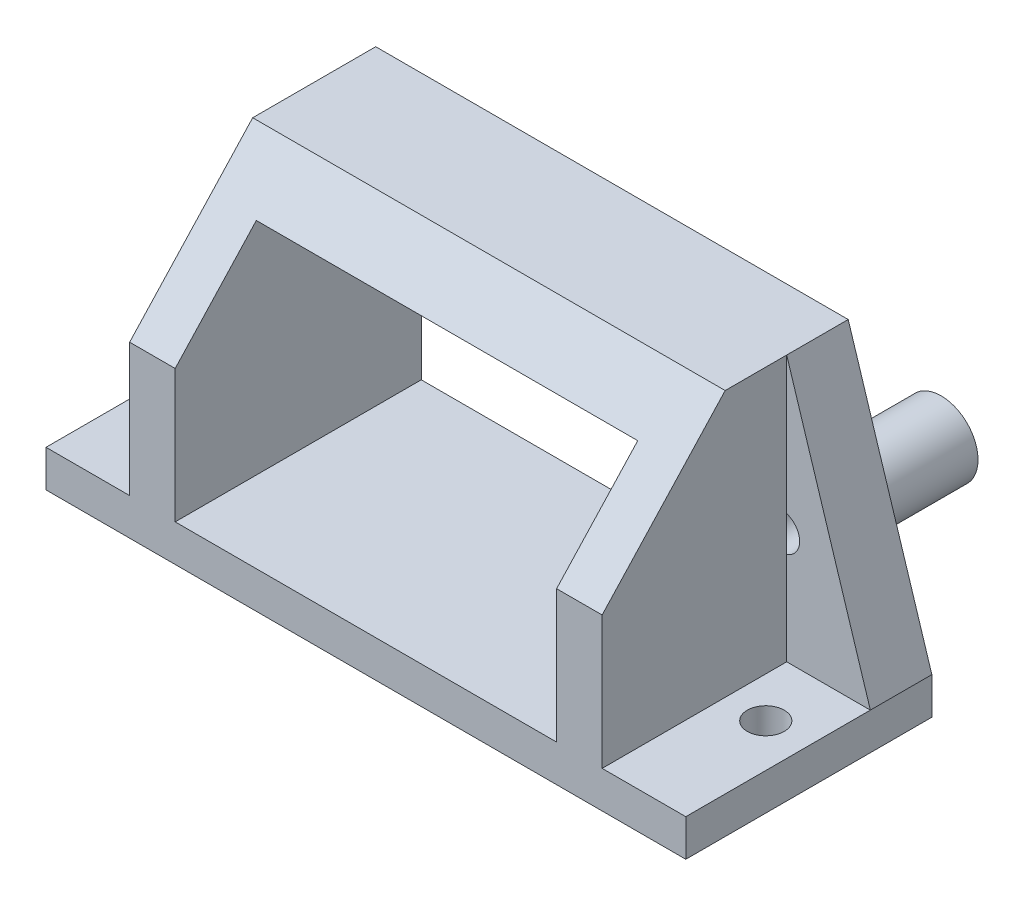
ISO-10303-21;
HEADER;
FILE_DESCRIPTION(('STEP AP214'),'2;1');
FILE_NAME('part.step','',(''),(''),'','','');
FILE_SCHEMA(('AUTOMOTIVE_DESIGN { 1 0 10303 214 1 1 1 1 }'));
ENDSEC;
DATA;
#1=APPLICATION_CONTEXT('core data for automotive mechanical design processes');
#2=APPLICATION_PROTOCOL_DEFINITION('international standard','automotive_design',2000,#1);
#3=PRODUCT_CONTEXT('',#1,'mechanical');
#4=PRODUCT('Part','Part','',(#3));
#5=PRODUCT_RELATED_PRODUCT_CATEGORY('part','',(#4));
#6=PRODUCT_DEFINITION_FORMATION('','',#4);
#7=PRODUCT_DEFINITION_CONTEXT('part definition',#1,'design');
#8=PRODUCT_DEFINITION('design','',#6,#7);
#9=PRODUCT_DEFINITION_SHAPE('','',#8);
#10=(LENGTH_UNIT() NAMED_UNIT(*) SI_UNIT(.MILLI.,.METRE.));
#11=(NAMED_UNIT(*) PLANE_ANGLE_UNIT() SI_UNIT($,.RADIAN.));
#12=(NAMED_UNIT(*) SI_UNIT($,.STERADIAN.) SOLID_ANGLE_UNIT());
#13=UNCERTAINTY_MEASURE_WITH_UNIT(LENGTH_MEASURE(1.E-05),#10,'distance_accuracy_value','');
#14=(GEOMETRIC_REPRESENTATION_CONTEXT(3) GLOBAL_UNCERTAINTY_ASSIGNED_CONTEXT((#13)) GLOBAL_UNIT_ASSIGNED_CONTEXT((#10,
#11,#12)) REPRESENTATION_CONTEXT('',''));
#15=CARTESIAN_POINT('',(0.,0.,0.));
#16=DIRECTION('',(0.,0.,1.));
#17=DIRECTION('',(1.,0.,0.));
#18=AXIS2_PLACEMENT_3D('',#15,#16,#17);
#19=CARTESIAN_POINT('',(0.,0.,0.));
#20=DIRECTION('',(0.,0.,1.));
#21=DIRECTION('',(1.,0.,0.));
#22=AXIS2_PLACEMENT_3D('',#19,#20,#21);
#23=PLANE('',#22);
#24=CARTESIAN_POINT('',(-18.75,12.,0.));
#25=DIRECTION('',(0.,0.,1.));
#26=DIRECTION('',(1.,0.,0.));
#27=AXIS2_PLACEMENT_3D('',#24,#25,#26);
#28=CIRCLE('',#27,3.);
#29=CARTESIAN_POINT('',(-15.75,12.,0.));
#30=VERTEX_POINT('',#29);
#31=EDGE_CURVE('E41',#30,#30,#28,.F.);
#32=ORIENTED_EDGE('',*,*,#31,.F.);
#33=EDGE_LOOP('',(#32));
#34=FACE_BOUND('',#33,.T.);
#35=DIRECTION('',(-0.30028587523271,0.953849250739196,0.));
#36=VECTOR('',#35,1.);
#37=CARTESIAN_POINT('',(19.2012575883234,24.5960053076786,0.));
#38=LINE('',#37,#36);
#39=CARTESIAN_POINT('',(26.,3.,0.));
#40=VERTEX_POINT('',#39);
#41=CARTESIAN_POINT('',(19.2012575883234,24.5960053076786,0.));
#42=VERTEX_POINT('',#41);
#43=EDGE_CURVE('E409',#40,#42,#38,.T.);
#44=ORIENTED_EDGE('',*,*,#43,.F.);
#45=DIRECTION('',(0.,1.,0.));
#46=VECTOR('',#45,1.);
#47=CARTESIAN_POINT('',(26.,0.,0.));
#48=LINE('',#47,#46);
#49=CARTESIAN_POINT('',(26.,0.,0.));
#50=VERTEX_POINT('',#49);
#51=EDGE_CURVE('E413',#50,#40,#48,.T.);
#52=ORIENTED_EDGE('',*,*,#51,.F.);
#53=DIRECTION('',(1.,0.,0.));
#54=VECTOR('',#53,1.);
#55=CARTESIAN_POINT('',(-26.,0.,0.));
#56=LINE('',#55,#54);
#57=CARTESIAN_POINT('',(-26.,0.,0.));
#58=VERTEX_POINT('',#57);
#59=EDGE_CURVE('E428',#58,#50,#56,.T.);
#60=ORIENTED_EDGE('',*,*,#59,.F.);
#61=DIRECTION('',(0.,-1.,0.));
#62=VECTOR('',#61,1.);
#63=CARTESIAN_POINT('',(-26.,3.,0.));
#64=LINE('',#63,#62);
#65=CARTESIAN_POINT('',(-26.,3.,0.));
#66=VERTEX_POINT('',#65);
#67=EDGE_CURVE('E426',#66,#58,#64,.T.);
#68=ORIENTED_EDGE('',*,*,#67,.F.);
#69=DIRECTION('',(-0.30028587523271,-0.953849250739196,0.));
#70=VECTOR('',#69,1.);
#71=CARTESIAN_POINT('',(-26.,3.,0.));
#72=LINE('',#71,#70);
#73=CARTESIAN_POINT('',(-19.2012575883234,24.5960053076786,0.));
#74=VERTEX_POINT('',#73);
#75=EDGE_CURVE('E423',#74,#66,#72,.T.);
#76=ORIENTED_EDGE('',*,*,#75,.F.);
#77=DIRECTION('',(-1.,0.,0.));
#78=VECTOR('',#77,1.);
#79=CARTESIAN_POINT('',(19.2012575883234,24.5960053076786,0.));
#80=LINE('',#79,#78);
#81=EDGE_CURVE('E421',#42,#74,#80,.T.);
#82=ORIENTED_EDGE('',*,*,#81,.F.);
#83=EDGE_LOOP('',(#44,#52,#60,#68,#76,#82));
#84=FACE_BOUND('',#83,.T.);
#85=DIRECTION('',(1.,0.,0.));
#86=VECTOR('',#85,1.);
#87=CARTESIAN_POINT('',(-15.5,3.,0.));
#88=LINE('',#87,#86);
#89=CARTESIAN_POINT('',(-15.5,3.,0.));
#90=VERTEX_POINT('',#89);
#91=CARTESIAN_POINT('',(15.5,3.,0.));
#92=VERTEX_POINT('',#91);
#93=EDGE_CURVE('E374',#90,#92,#88,.T.);
#94=ORIENTED_EDGE('',*,*,#93,.T.);
#95=DIRECTION('',(0.,1.,0.));
#96=VECTOR('',#95,1.);
#97=CARTESIAN_POINT('',(15.5,20.9192804275844,0.));
#98=LINE('',#97,#96);
#99=CARTESIAN_POINT('',(15.5,20.9192804275844,0.));
#100=VERTEX_POINT('',#99);
#101=EDGE_CURVE('E383',#92,#100,#98,.T.);
#102=ORIENTED_EDGE('',*,*,#101,.T.);
#103=DIRECTION('',(-1.,0.,0.));
#104=VECTOR('',#103,1.);
#105=CARTESIAN_POINT('',(-15.5,20.9192804275844,0.));
#106=LINE('',#105,#104);
#107=CARTESIAN_POINT('',(-15.5,20.9192804275844,0.));
#108=VERTEX_POINT('',#107);
#109=EDGE_CURVE('E397',#100,#108,#106,.T.);
#110=ORIENTED_EDGE('',*,*,#109,.T.);
#111=DIRECTION('',(0.,-1.,0.));
#112=VECTOR('',#111,1.);
#113=CARTESIAN_POINT('',(-15.5,3.,0.));
#114=LINE('',#113,#112);
#115=EDGE_CURVE('E389',#108,#90,#114,.T.);
#116=ORIENTED_EDGE('',*,*,#115,.T.);
#117=EDGE_LOOP('',(#94,#102,#110,#116));
#118=FACE_BOUND('',#117,.T.);
#119=CARTESIAN_POINT('',(18.75,12.,0.));
#120=DIRECTION('',(0.,0.,1.));
#121=DIRECTION('',(1.,0.,0.));
#122=AXIS2_PLACEMENT_3D('',#119,#120,#121);
#123=CIRCLE('',#122,3.);
#124=CARTESIAN_POINT('',(21.75,12.,0.));
#125=VERTEX_POINT('',#124);
#126=EDGE_CURVE('E11',#125,#125,#123,.F.);
#127=ORIENTED_EDGE('',*,*,#126,.F.);
#128=EDGE_LOOP('',(#127));
#129=FACE_BOUND('',#128,.T.);
#130=ADVANCED_FACE('F33',(#34,#84,#118,#129),#23,.F.);
#131=CARTESIAN_POINT('',(0.,0.,20.));
#132=DIRECTION('',(0.,0.,1.));
#133=DIRECTION('',(1.,0.,0.));
#134=AXIS2_PLACEMENT_3D('',#131,#132,#133);
#135=PLANE('',#134);
#136=DIRECTION('',(0.,1.,0.));
#137=VECTOR('',#136,1.);
#138=CARTESIAN_POINT('',(-19.2012575883234,3.,20.));
#139=LINE('',#138,#137);
#140=CARTESIAN_POINT('',(-19.2012575883234,3.,20.));
#141=VERTEX_POINT('',#140);
#142=CARTESIAN_POINT('',(-19.2012575883234,13.7980026538393,20.));
#143=VERTEX_POINT('',#142);
#144=EDGE_CURVE('E197',#141,#143,#139,.T.);
#145=ORIENTED_EDGE('',*,*,#144,.F.);
#146=DIRECTION('',(1.,0.,0.));
#147=VECTOR('',#146,1.);
#148=CARTESIAN_POINT('',(-26.,3.,20.));
#149=LINE('',#148,#147);
#150=CARTESIAN_POINT('',(-26.,3.,20.));
#151=VERTEX_POINT('',#150);
#152=EDGE_CURVE('E193',#151,#141,#149,.T.);
#153=ORIENTED_EDGE('',*,*,#152,.F.);
#154=DIRECTION('',(0.,-1.,0.));
#155=VECTOR('',#154,1.);
#156=CARTESIAN_POINT('',(-26.,3.,20.));
#157=LINE('',#156,#155);
#158=CARTESIAN_POINT('',(-26.,0.,20.));
#159=VERTEX_POINT('',#158);
#160=EDGE_CURVE('E410',#151,#159,#157,.T.);
#161=ORIENTED_EDGE('',*,*,#160,.T.);
#162=DIRECTION('',(1.,0.,0.));
#163=VECTOR('',#162,1.);
#164=CARTESIAN_POINT('',(-26.,0.,20.));
#165=LINE('',#164,#163);
#166=CARTESIAN_POINT('',(26.,0.,20.));
#167=VERTEX_POINT('',#166);
#168=EDGE_CURVE('E412',#159,#167,#165,.T.);
#169=ORIENTED_EDGE('',*,*,#168,.T.);
#170=DIRECTION('',(0.,1.,0.));
#171=VECTOR('',#170,1.);
#172=CARTESIAN_POINT('',(26.,0.,20.));
#173=LINE('',#172,#171);
#174=CARTESIAN_POINT('',(26.,3.,20.));
#175=VERTEX_POINT('',#174);
#176=EDGE_CURVE('E415',#167,#175,#173,.T.);
#177=ORIENTED_EDGE('',*,*,#176,.T.);
#178=DIRECTION('',(1.,0.,0.));
#179=VECTOR('',#178,1.);
#180=CARTESIAN_POINT('',(19.2012575883234,3.,20.));
#181=LINE('',#180,#179);
#182=CARTESIAN_POINT('',(19.2012575883234,3.,20.));
#183=VERTEX_POINT('',#182);
#184=EDGE_CURVE('E186',#183,#175,#181,.T.);
#185=ORIENTED_EDGE('',*,*,#184,.F.);
#186=DIRECTION('',(0.,-1.,0.));
#187=VECTOR('',#186,1.);
#188=CARTESIAN_POINT('',(19.2012575883234,24.5960053076786,20.));
#189=LINE('',#188,#187);
#190=CARTESIAN_POINT('',(19.2012575883234,13.7980026538393,20.));
#191=VERTEX_POINT('',#190);
#192=EDGE_CURVE('E187',#191,#183,#189,.T.);
#193=ORIENTED_EDGE('',*,*,#192,.F.);
#194=DIRECTION('',(1.,0.,0.));
#195=VECTOR('',#194,1.);
#196=CARTESIAN_POINT('',(-61.5,13.7980026538393,20.));
#197=LINE('',#196,#195);
#198=CARTESIAN_POINT('',(15.5,13.7980026538393,20.));
#199=VERTEX_POINT('',#198);
#200=EDGE_CURVE('E457',#199,#191,#197,.T.);
#201=ORIENTED_EDGE('',*,*,#200,.F.);
#202=DIRECTION('',(0.,1.,0.));
#203=VECTOR('',#202,1.);
#204=CARTESIAN_POINT('',(15.5,20.9192804275844,20.));
#205=LINE('',#204,#203);
#206=CARTESIAN_POINT('',(15.5,3.,20.));
#207=VERTEX_POINT('',#206);
#208=EDGE_CURVE('E400',#207,#199,#205,.T.);
#209=ORIENTED_EDGE('',*,*,#208,.F.);
#210=DIRECTION('',(1.,0.,0.));
#211=VECTOR('',#210,1.);
#212=CARTESIAN_POINT('',(-15.5,3.,20.));
#213=LINE('',#212,#211);
#214=CARTESIAN_POINT('',(-15.5,3.,20.));
#215=VERTEX_POINT('',#214);
#216=EDGE_CURVE('E398',#215,#207,#213,.T.);
#217=ORIENTED_EDGE('',*,*,#216,.F.);
#218=DIRECTION('',(0.,-1.,0.));
#219=VECTOR('',#218,1.);
#220=CARTESIAN_POINT('',(-15.5,3.,20.));
#221=LINE('',#220,#219);
#222=CARTESIAN_POINT('',(-15.5,13.7980026538393,20.));
#223=VERTEX_POINT('',#222);
#224=EDGE_CURVE('E392',#223,#215,#221,.T.);
#225=ORIENTED_EDGE('',*,*,#224,.F.);
#226=EDGE_CURVE('E451',#143,#223,#197,.T.);
#227=ORIENTED_EDGE('',*,*,#226,.F.);
#228=EDGE_LOOP('',(#145,#153,#161,#169,#177,#185,#193,#201,#209,#217,#225,#227));
#229=FACE_BOUND('',#228,.T.);
#230=ADVANCED_FACE('F245',(#229),#135,.T.);
#231=CARTESIAN_POINT('',(19.2012575883234,24.5960053076786,20.));
#232=DIRECTION('',(-0.953849250739196,-0.30028587523271,0.));
#233=DIRECTION('',(0.30028587523271,-0.953849250739196,0.));
#234=AXIS2_PLACEMENT_3D('',#231,#232,#233);
#235=PLANE('',#234);
#236=DIRECTION('',(0.,0.,-1.));
#237=VECTOR('',#236,1.);
#238=CARTESIAN_POINT('',(19.2012575883234,24.5960053076786,20.));
#239=LINE('',#238,#237);
#240=CARTESIAN_POINT('',(19.2012575883234,24.5960053076786,4.99999999999995));
#241=VERTEX_POINT('',#240);
#242=EDGE_CURVE('E293',#241,#42,#239,.T.);
#243=ORIENTED_EDGE('',*,*,#242,.F.);
#244=DIRECTION('',(-0.30028587523271,0.953849250739196,0.));
#245=VECTOR('',#244,1.);
#246=CARTESIAN_POINT('',(26.,3.,4.99999999999995));
#247=LINE('',#246,#245);
#248=CARTESIAN_POINT('',(26.,3.,4.99999999999995));
#249=VERTEX_POINT('',#248);
#250=EDGE_CURVE('E180',#249,#241,#247,.T.);
#251=ORIENTED_EDGE('',*,*,#250,.F.);
#252=DIRECTION('',(0.,0.,-1.));
#253=VECTOR('',#252,1.);
#254=CARTESIAN_POINT('',(26.,3.,20.));
#255=LINE('',#254,#253);
#256=EDGE_CURVE('E418',#249,#40,#255,.T.);
#257=ORIENTED_EDGE('',*,*,#256,.T.);
#258=ORIENTED_EDGE('',*,*,#43,.T.);
#259=EDGE_LOOP('',(#243,#251,#257,#258));
#260=FACE_BOUND('',#259,.T.);
#261=ADVANCED_FACE('F35',(#260),#235,.F.);
#262=CARTESIAN_POINT('',(19.2012575883234,24.5960053076786,20.));
#263=DIRECTION('',(0.,-1.,0.));
#264=DIRECTION('',(1.,0.,0.));
#265=AXIS2_PLACEMENT_3D('',#262,#263,#264);
#266=PLANE('',#265);
#267=DIRECTION('',(0.,0.,-1.));
#268=VECTOR('',#267,1.);
#269=CARTESIAN_POINT('',(-19.2012575883234,24.5960053076786,20.));
#270=LINE('',#269,#268);
#271=CARTESIAN_POINT('',(-19.2012575883234,24.5960053076786,10.));
#272=VERTEX_POINT('',#271);
#273=CARTESIAN_POINT('',(-19.2012575883234,24.5960053076786,4.99999999999995));
#274=VERTEX_POINT('',#273);
#275=EDGE_CURVE('E284',#272,#274,#270,.T.);
#276=ORIENTED_EDGE('',*,*,#275,.F.);
#277=DIRECTION('',(1.,0.,0.));
#278=VECTOR('',#277,1.);
#279=CARTESIAN_POINT('',(-61.5,24.5960053076786,10.));
#280=LINE('',#279,#278);
#281=CARTESIAN_POINT('',(19.2012575883234,24.5960053076786,10.));
#282=VERTEX_POINT('',#281);
#283=EDGE_CURVE('E287',#272,#282,#280,.T.);
#284=ORIENTED_EDGE('',*,*,#283,.T.);
#285=EDGE_CURVE('E295',#282,#241,#239,.T.);
#286=ORIENTED_EDGE('',*,*,#285,.T.);
#287=ORIENTED_EDGE('',*,*,#242,.T.);
#288=ORIENTED_EDGE('',*,*,#81,.T.);
#289=EDGE_CURVE('E289',#274,#74,#270,.T.);
#290=ORIENTED_EDGE('',*,*,#289,.F.);
#291=EDGE_LOOP('',(#276,#284,#286,#287,#288,#290));
#292=FACE_BOUND('',#291,.T.);
#293=ADVANCED_FACE('F272',(#292),#266,.F.);
#294=CARTESIAN_POINT('',(-26.,3.,20.));
#295=DIRECTION('',(0.953849250739196,-0.30028587523271,0.));
#296=DIRECTION('',(0.30028587523271,0.953849250739196,0.));
#297=AXIS2_PLACEMENT_3D('',#294,#295,#296);
#298=PLANE('',#297);
#299=DIRECTION('',(0.,0.,-1.));
#300=VECTOR('',#299,1.);
#301=CARTESIAN_POINT('',(-26.,3.,20.));
#302=LINE('',#301,#300);
#303=CARTESIAN_POINT('',(-26.,3.,4.99999999999995));
#304=VERTEX_POINT('',#303);
#305=EDGE_CURVE('E438',#304,#66,#302,.T.);
#306=ORIENTED_EDGE('',*,*,#305,.F.);
#307=DIRECTION('',(-0.300285875232709,-0.953849250739196,0.));
#308=VECTOR('',#307,1.);
#309=CARTESIAN_POINT('',(-19.2012575883234,24.5960053076786,4.99999999999995));
#310=LINE('',#309,#308);
#311=EDGE_CURVE('E202',#274,#304,#310,.T.);
#312=ORIENTED_EDGE('',*,*,#311,.F.);
#313=ORIENTED_EDGE('',*,*,#289,.T.);
#314=ORIENTED_EDGE('',*,*,#75,.T.);
#315=EDGE_LOOP('',(#306,#312,#313,#314));
#316=FACE_BOUND('',#315,.T.);
#317=ADVANCED_FACE('F269',(#316),#298,.F.);
#318=CARTESIAN_POINT('',(-26.,3.,20.));
#319=DIRECTION('',(1.,0.,0.));
#320=DIRECTION('',(0.,1.,0.));
#321=AXIS2_PLACEMENT_3D('',#318,#319,#320);
#322=PLANE('',#321);
#323=ORIENTED_EDGE('',*,*,#67,.T.);
#324=DIRECTION('',(0.,0.,-1.));
#325=VECTOR('',#324,1.);
#326=CARTESIAN_POINT('',(-26.,0.,20.));
#327=LINE('',#326,#325);
#328=EDGE_CURVE('E436',#159,#58,#327,.T.);
#329=ORIENTED_EDGE('',*,*,#328,.F.);
#330=ORIENTED_EDGE('',*,*,#160,.F.);
#331=EDGE_CURVE('E297',#151,#304,#302,.T.);
#332=ORIENTED_EDGE('',*,*,#331,.T.);
#333=ORIENTED_EDGE('',*,*,#305,.T.);
#334=EDGE_LOOP('',(#323,#329,#330,#332,#333));
#335=FACE_BOUND('',#334,.T.);
#336=ADVANCED_FACE('F265',(#335),#322,.F.);
#337=CARTESIAN_POINT('',(-26.,0.,20.));
#338=DIRECTION('',(0.,1.,0.));
#339=DIRECTION('',(0.,0.,1.));
#340=AXIS2_PLACEMENT_3D('',#337,#338,#339);
#341=PLANE('',#340);
#342=CARTESIAN_POINT('',(22.5,0.,10.));
#343=DIRECTION('',(0.,-1.,0.));
#344=DIRECTION('',(0.,0.,-1.));
#345=AXIS2_PLACEMENT_3D('',#342,#343,#344);
#346=CIRCLE('',#345,1.5);
#347=CARTESIAN_POINT('',(22.5,0.,8.5));
#348=VERTEX_POINT('',#347);
#349=EDGE_CURVE('E212',#348,#348,#346,.T.);
#350=ORIENTED_EDGE('',*,*,#349,.F.);
#351=EDGE_LOOP('',(#350));
#352=FACE_BOUND('',#351,.T.);
#353=CARTESIAN_POINT('',(-22.5,0.,10.));
#354=DIRECTION('',(0.,-1.,0.));
#355=DIRECTION('',(0.,0.,-1.));
#356=AXIS2_PLACEMENT_3D('',#353,#354,#355);
#357=CIRCLE('',#356,1.5);
#358=CARTESIAN_POINT('',(-22.5,0.,8.5));
#359=VERTEX_POINT('',#358);
#360=EDGE_CURVE('E208',#359,#359,#357,.T.);
#361=ORIENTED_EDGE('',*,*,#360,.F.);
#362=EDGE_LOOP('',(#361));
#363=FACE_BOUND('',#362,.T.);
#364=ORIENTED_EDGE('',*,*,#59,.T.);
#365=DIRECTION('',(0.,0.,-1.));
#366=VECTOR('',#365,1.);
#367=CARTESIAN_POINT('',(26.,0.,20.));
#368=LINE('',#367,#366);
#369=EDGE_CURVE('E434',#167,#50,#368,.T.);
#370=ORIENTED_EDGE('',*,*,#369,.F.);
#371=ORIENTED_EDGE('',*,*,#168,.F.);
#372=ORIENTED_EDGE('',*,*,#328,.T.);
#373=EDGE_LOOP('',(#364,#370,#371,#372));
#374=FACE_BOUND('',#373,.T.);
#375=ADVANCED_FACE('F261',(#352,#363,#374),#341,.F.);
#376=CARTESIAN_POINT('',(26.,0.,20.));
#377=DIRECTION('',(-1.,0.,0.));
#378=DIRECTION('',(0.,0.,1.));
#379=AXIS2_PLACEMENT_3D('',#376,#377,#378);
#380=PLANE('',#379);
#381=ORIENTED_EDGE('',*,*,#51,.T.);
#382=ORIENTED_EDGE('',*,*,#256,.F.);
#383=EDGE_CURVE('E432',#175,#249,#255,.T.);
#384=ORIENTED_EDGE('',*,*,#383,.F.);
#385=ORIENTED_EDGE('',*,*,#176,.F.);
#386=ORIENTED_EDGE('',*,*,#369,.T.);
#387=EDGE_LOOP('',(#381,#382,#384,#385,#386));
#388=FACE_BOUND('',#387,.T.);
#389=ADVANCED_FACE('F257',(#388),#380,.F.);
#390=CARTESIAN_POINT('',(-15.5,3.,20.));
#391=DIRECTION('',(0.,1.,0.));
#392=DIRECTION('',(-1.,0.,0.));
#393=AXIS2_PLACEMENT_3D('',#390,#391,#392);
#394=PLANE('',#393);
#395=ORIENTED_EDGE('',*,*,#93,.F.);
#396=DIRECTION('',(0.,0.,-1.));
#397=VECTOR('',#396,1.);
#398=CARTESIAN_POINT('',(-15.5,3.,20.));
#399=LINE('',#398,#397);
#400=EDGE_CURVE('E376',#215,#90,#399,.T.);
#401=ORIENTED_EDGE('',*,*,#400,.F.);
#402=ORIENTED_EDGE('',*,*,#216,.T.);
#403=DIRECTION('',(0.,0.,-1.));
#404=VECTOR('',#403,1.);
#405=CARTESIAN_POINT('',(15.5,3.,20.));
#406=LINE('',#405,#404);
#407=EDGE_CURVE('E379',#207,#92,#406,.T.);
#408=ORIENTED_EDGE('',*,*,#407,.T.);
#409=EDGE_LOOP('',(#395,#401,#402,#408));
#410=FACE_BOUND('',#409,.T.);
#411=ADVANCED_FACE('F260',(#410),#394,.T.);
#412=CARTESIAN_POINT('',(15.5,20.9192804275844,20.));
#413=DIRECTION('',(-1.,0.,0.));
#414=DIRECTION('',(0.,0.,1.));
#415=AXIS2_PLACEMENT_3D('',#412,#413,#414);
#416=PLANE('',#415);
#417=DIRECTION('',(0.,-0.73369802558179,0.679475685552753));
#418=VECTOR('',#417,1.);
#419=CARTESIAN_POINT('',(15.5,17.6314775801199,16.4498296127778));
#420=LINE('',#419,#418);
#421=CARTESIAN_POINT('',(15.5,20.9192804275844,13.4050046086874));
#422=VERTEX_POINT('',#421);
#423=EDGE_CURVE('E384',#422,#199,#420,.T.);
#424=ORIENTED_EDGE('',*,*,#423,.F.);
#425=DIRECTION('',(0.,0.,-1.));
#426=VECTOR('',#425,1.);
#427=CARTESIAN_POINT('',(15.5,20.9192804275844,20.));
#428=LINE('',#427,#426);
#429=EDGE_CURVE('E406',#422,#100,#428,.T.);
#430=ORIENTED_EDGE('',*,*,#429,.T.);
#431=ORIENTED_EDGE('',*,*,#101,.F.);
#432=ORIENTED_EDGE('',*,*,#407,.F.);
#433=ORIENTED_EDGE('',*,*,#208,.T.);
#434=EDGE_LOOP('',(#424,#430,#431,#432,#433));
#435=FACE_BOUND('',#434,.T.);
#436=ADVANCED_FACE('F363',(#435),#416,.T.);
#437=CARTESIAN_POINT('',(-15.5,20.9192804275844,20.));
#438=DIRECTION('',(0.,-1.,0.));
#439=DIRECTION('',(0.,0.,-1.));
#440=AXIS2_PLACEMENT_3D('',#437,#438,#439);
#441=PLANE('',#440);
#442=DIRECTION('',(1.,0.,0.));
#443=VECTOR('',#442,1.);
#444=CARTESIAN_POINT('',(-15.5,20.9192804275844,13.4050046086874));
#445=LINE('',#444,#443);
#446=CARTESIAN_POINT('',(-15.5,20.9192804275844,13.4050046086874));
#447=VERTEX_POINT('',#446);
#448=EDGE_CURVE('E454',#447,#422,#445,.T.);
#449=ORIENTED_EDGE('',*,*,#448,.F.);
#450=DIRECTION('',(0.,0.,-1.));
#451=VECTOR('',#450,1.);
#452=CARTESIAN_POINT('',(-15.5,20.9192804275844,20.));
#453=LINE('',#452,#451);
#454=EDGE_CURVE('E393',#447,#108,#453,.T.);
#455=ORIENTED_EDGE('',*,*,#454,.T.);
#456=ORIENTED_EDGE('',*,*,#109,.F.);
#457=ORIENTED_EDGE('',*,*,#429,.F.);
#458=EDGE_LOOP('',(#449,#455,#456,#457));
#459=FACE_BOUND('',#458,.T.);
#460=ADVANCED_FACE('F359',(#459),#441,.T.);
#461=CARTESIAN_POINT('',(-15.5,3.,20.));
#462=DIRECTION('',(1.,0.,0.));
#463=DIRECTION('',(0.,0.,-1.));
#464=AXIS2_PLACEMENT_3D('',#461,#462,#463);
#465=PLANE('',#464);
#466=DIRECTION('',(0.,0.73369802558179,-0.679475685552753));
#467=VECTOR('',#466,1.);
#468=CARTESIAN_POINT('',(-15.5,7.98529968920888,25.3831279274262));
#469=LINE('',#468,#467);
#470=EDGE_CURVE('E301',#223,#447,#469,.T.);
#471=ORIENTED_EDGE('',*,*,#470,.F.);
#472=ORIENTED_EDGE('',*,*,#224,.T.);
#473=ORIENTED_EDGE('',*,*,#400,.T.);
#474=ORIENTED_EDGE('',*,*,#115,.F.);
#475=ORIENTED_EDGE('',*,*,#454,.F.);
#476=EDGE_LOOP('',(#471,#472,#473,#474,#475));
#477=FACE_BOUND('',#476,.T.);
#478=ADVANCED_FACE('F355',(#477),#465,.T.);
#479=CARTESIAN_POINT('',(-61.5,13.7980026538393,20.));
#480=DIRECTION('',(0.,-0.679475685552753,-0.73369802558179));
#481=DIRECTION('',(0.,0.73369802558179,-0.679475685552753));
#482=AXIS2_PLACEMENT_3D('',#479,#480,#481);
#483=PLANE('',#482);
#484=ORIENTED_EDGE('',*,*,#283,.F.);
#485=DIRECTION('',(0.,-0.73369802558179,0.679475685552753));
#486=VECTOR('',#485,1.);
#487=CARTESIAN_POINT('',(-19.2012575883234,13.7980026538393,20.));
#488=LINE('',#487,#486);
#489=EDGE_CURVE('E162',#272,#143,#488,.T.);
#490=ORIENTED_EDGE('',*,*,#489,.T.);
#491=ORIENTED_EDGE('',*,*,#226,.T.);
#492=ORIENTED_EDGE('',*,*,#470,.T.);
#493=ORIENTED_EDGE('',*,*,#448,.T.);
#494=ORIENTED_EDGE('',*,*,#423,.T.);
#495=ORIENTED_EDGE('',*,*,#200,.T.);
#496=DIRECTION('',(0.,0.73369802558179,-0.679475685552753));
#497=VECTOR('',#496,1.);
#498=CARTESIAN_POINT('',(19.2012575883234,13.7980026538393,20.));
#499=LINE('',#498,#497);
#500=EDGE_CURVE('E303',#191,#282,#499,.T.);
#501=ORIENTED_EDGE('',*,*,#500,.T.);
#502=EDGE_LOOP('',(#484,#490,#491,#492,#493,#494,#495,#501));
#503=FACE_BOUND('',#502,.T.);
#504=ADVANCED_FACE('F352',(#503),#483,.F.);
#505=CARTESIAN_POINT('',(19.2012575883234,24.5960053076786,4.99999999999995));
#506=DIRECTION('',(-1.,0.,0.));
#507=DIRECTION('',(0.,-1.,0.));
#508=AXIS2_PLACEMENT_3D('',#505,#506,#507);
#509=PLANE('',#508);
#510=ORIENTED_EDGE('',*,*,#192,.T.);
#511=DIRECTION('',(0.,0.,1.));
#512=VECTOR('',#511,1.);
#513=CARTESIAN_POINT('',(19.2012575883234,3.,4.99999999999995));
#514=LINE('',#513,#512);
#515=CARTESIAN_POINT('',(19.2012575883234,3.,4.99999999999995));
#516=VERTEX_POINT('',#515);
#517=EDGE_CURVE('E183',#516,#183,#514,.T.);
#518=ORIENTED_EDGE('',*,*,#517,.F.);
#519=DIRECTION('',(0.,-1.,0.));
#520=VECTOR('',#519,1.);
#521=CARTESIAN_POINT('',(19.2012575883234,24.5960053076786,4.99999999999995));
#522=LINE('',#521,#520);
#523=CARTESIAN_POINT('',(19.2012575883234,10.5694872985602,4.99999999999995));
#524=VERTEX_POINT('',#523);
#525=EDGE_CURVE('E175',#524,#516,#522,.T.);
#526=ORIENTED_EDGE('',*,*,#525,.F.);
#527=CARTESIAN_POINT('',(19.2012575883234,13.4305127014398,4.99999999999995));
#528=VERTEX_POINT('',#527);
#529=EDGE_CURVE('E167',#528,#524,#522,.T.);
#530=ORIENTED_EDGE('',*,*,#529,.F.);
#531=EDGE_CURVE('E172',#241,#528,#522,.T.);
#532=ORIENTED_EDGE('',*,*,#531,.F.);
#533=ORIENTED_EDGE('',*,*,#285,.F.);
#534=ORIENTED_EDGE('',*,*,#500,.F.);
#535=EDGE_LOOP('',(#510,#518,#526,#530,#532,#533,#534));
#536=FACE_BOUND('',#535,.T.);
#537=ADVANCED_FACE('F171',(#536),#509,.F.);
#538=CARTESIAN_POINT('',(19.2012575883234,3.,4.99999999999995));
#539=DIRECTION('',(0.,-1.,0.));
#540=DIRECTION('',(1.,0.,0.));
#541=AXIS2_PLACEMENT_3D('',#538,#539,#540);
#542=PLANE('',#541);
#543=CARTESIAN_POINT('',(22.5,3.,10.));
#544=DIRECTION('',(0.,-1.,0.));
#545=DIRECTION('',(1.,0.,0.));
#546=AXIS2_PLACEMENT_3D('',#543,#544,#545);
#547=CIRCLE('',#546,1.5);
#548=CARTESIAN_POINT('',(24.,3.,10.));
#549=VERTEX_POINT('',#548);
#550=EDGE_CURVE('E211',#549,#549,#547,.T.);
#551=ORIENTED_EDGE('',*,*,#550,.T.);
#552=EDGE_LOOP('',(#551));
#553=FACE_BOUND('',#552,.T.);
#554=ORIENTED_EDGE('',*,*,#184,.T.);
#555=ORIENTED_EDGE('',*,*,#383,.T.);
#556=DIRECTION('',(1.,0.,0.));
#557=VECTOR('',#556,1.);
#558=CARTESIAN_POINT('',(19.2012575883234,3.,4.99999999999995));
#559=LINE('',#558,#557);
#560=EDGE_CURVE('E182',#516,#249,#559,.T.);
#561=ORIENTED_EDGE('',*,*,#560,.F.);
#562=ORIENTED_EDGE('',*,*,#517,.T.);
#563=EDGE_LOOP('',(#554,#555,#561,#562));
#564=FACE_BOUND('',#563,.T.);
#565=ADVANCED_FACE('F315',(#553,#564),#542,.F.);
#566=CARTESIAN_POINT('',(0.,0.,4.99999999999995));
#567=DIRECTION('',(0.,0.,-1.));
#568=DIRECTION('',(-1.,0.,0.));
#569=AXIS2_PLACEMENT_3D('',#566,#567,#568);
#570=PLANE('',#569);
#571=ORIENTED_EDGE('',*,*,#531,.T.);
#572=CARTESIAN_POINT('',(18.75,12.,4.99999999999995));
#573=DIRECTION('',(0.,0.,-1.));
#574=DIRECTION('',(-1.,0.,0.));
#575=AXIS2_PLACEMENT_3D('',#572,#573,#574);
#576=CIRCLE('',#575,1.5);
#577=EDGE_CURVE('E156',#528,#524,#576,.T.);
#578=ORIENTED_EDGE('',*,*,#577,.T.);
#579=ORIENTED_EDGE('',*,*,#525,.T.);
#580=ORIENTED_EDGE('',*,*,#560,.T.);
#581=ORIENTED_EDGE('',*,*,#250,.T.);
#582=EDGE_LOOP('',(#571,#578,#579,#580,#581));
#583=FACE_BOUND('',#582,.T.);
#584=ADVANCED_FACE('F177',(#583),#570,.F.);
#585=CARTESIAN_POINT('',(-19.2012575883234,3.,4.99999999999995));
#586=DIRECTION('',(1.,0.,0.));
#587=DIRECTION('',(0.,0.,-1.));
#588=AXIS2_PLACEMENT_3D('',#585,#586,#587);
#589=PLANE('',#588);
#590=ORIENTED_EDGE('',*,*,#275,.T.);
#591=DIRECTION('',(0.,1.,0.));
#592=VECTOR('',#591,1.);
#593=CARTESIAN_POINT('',(-19.2012575883234,3.,4.99999999999995));
#594=LINE('',#593,#592);
#595=CARTESIAN_POINT('',(-19.2012575883234,13.4305127014398,4.99999999999995));
#596=VERTEX_POINT('',#595);
#597=EDGE_CURVE('E196',#596,#274,#594,.T.);
#598=ORIENTED_EDGE('',*,*,#597,.F.);
#599=CARTESIAN_POINT('',(-19.2012575883234,10.5694872985602,4.99999999999995));
#600=VERTEX_POINT('',#599);
#601=EDGE_CURVE('E207',#600,#596,#594,.T.);
#602=ORIENTED_EDGE('',*,*,#601,.F.);
#603=CARTESIAN_POINT('',(-19.2012575883234,3.,4.99999999999995));
#604=VERTEX_POINT('',#603);
#605=EDGE_CURVE('E204',#604,#600,#594,.T.);
#606=ORIENTED_EDGE('',*,*,#605,.F.);
#607=DIRECTION('',(0.,0.,1.));
#608=VECTOR('',#607,1.);
#609=CARTESIAN_POINT('',(-19.2012575883234,3.,4.99999999999995));
#610=LINE('',#609,#608);
#611=EDGE_CURVE('E190',#604,#141,#610,.T.);
#612=ORIENTED_EDGE('',*,*,#611,.T.);
#613=ORIENTED_EDGE('',*,*,#144,.T.);
#614=ORIENTED_EDGE('',*,*,#489,.F.);
#615=EDGE_LOOP('',(#590,#598,#602,#606,#612,#613,#614));
#616=FACE_BOUND('',#615,.T.);
#617=ADVANCED_FACE('F342',(#616),#589,.F.);
#618=CARTESIAN_POINT('',(-26.,3.,4.99999999999995));
#619=DIRECTION('',(0.,-1.,0.));
#620=DIRECTION('',(0.,0.,-1.));
#621=AXIS2_PLACEMENT_3D('',#618,#619,#620);
#622=PLANE('',#621);
#623=CARTESIAN_POINT('',(-22.5,3.,10.));
#624=DIRECTION('',(0.,-1.,0.));
#625=DIRECTION('',(0.,0.,-1.));
#626=AXIS2_PLACEMENT_3D('',#623,#624,#625);
#627=CIRCLE('',#626,1.5);
#628=CARTESIAN_POINT('',(-22.5,3.,8.5));
#629=VERTEX_POINT('',#628);
#630=EDGE_CURVE('E199',#629,#629,#627,.T.);
#631=ORIENTED_EDGE('',*,*,#630,.T.);
#632=EDGE_LOOP('',(#631));
#633=FACE_BOUND('',#632,.T.);
#634=ORIENTED_EDGE('',*,*,#152,.T.);
#635=ORIENTED_EDGE('',*,*,#611,.F.);
#636=DIRECTION('',(1.,0.,0.));
#637=VECTOR('',#636,1.);
#638=CARTESIAN_POINT('',(-26.,3.,4.99999999999995));
#639=LINE('',#638,#637);
#640=EDGE_CURVE('E192',#304,#604,#639,.T.);
#641=ORIENTED_EDGE('',*,*,#640,.F.);
#642=ORIENTED_EDGE('',*,*,#331,.F.);
#643=EDGE_LOOP('',(#634,#635,#641,#642));
#644=FACE_BOUND('',#643,.T.);
#645=ADVANCED_FACE('F338',(#633,#644),#622,.F.);
#646=CARTESIAN_POINT('',(0.,0.,4.99999999999995));
#647=DIRECTION('',(0.,0.,-1.));
#648=DIRECTION('',(-1.,0.,0.));
#649=AXIS2_PLACEMENT_3D('',#646,#647,#648);
#650=PLANE('',#649);
#651=ORIENTED_EDGE('',*,*,#605,.T.);
#652=CARTESIAN_POINT('',(-18.75,12.,4.99999999999995));
#653=DIRECTION('',(0.,0.,1.));
#654=DIRECTION('',(1.,0.,0.));
#655=AXIS2_PLACEMENT_3D('',#652,#653,#654);
#656=CIRCLE('',#655,1.5);
#657=EDGE_CURVE('E215',#596,#600,#656,.T.);
#658=ORIENTED_EDGE('',*,*,#657,.F.);
#659=ORIENTED_EDGE('',*,*,#597,.T.);
#660=ORIENTED_EDGE('',*,*,#311,.T.);
#661=ORIENTED_EDGE('',*,*,#640,.T.);
#662=EDGE_LOOP('',(#651,#658,#659,#660,#661));
#663=FACE_BOUND('',#662,.T.);
#664=ADVANCED_FACE('F331',(#663),#650,.F.);
#665=CARTESIAN_POINT('',(-22.5,15.,10.));
#666=DIRECTION('',(0.,-1.,0.));
#667=DIRECTION('',(0.,0.,-1.));
#668=AXIS2_PLACEMENT_3D('',#665,#666,#667);
#669=CYLINDRICAL_SURFACE('',#668,1.5);
#670=ORIENTED_EDGE('',*,*,#360,.T.);
#671=EDGE_LOOP('',(#670));
#672=FACE_BOUND('',#671,.T.);
#673=ORIENTED_EDGE('',*,*,#630,.F.);
#674=EDGE_LOOP('',(#673));
#675=FACE_BOUND('',#674,.T.);
#676=ADVANCED_FACE('F321',(#672,#675),#669,.F.);
#677=CARTESIAN_POINT('',(22.5,15.,10.));
#678=DIRECTION('',(0.,-1.,0.));
#679=DIRECTION('',(0.,0.,-1.));
#680=AXIS2_PLACEMENT_3D('',#677,#678,#679);
#681=CYLINDRICAL_SURFACE('',#680,1.5);
#682=ORIENTED_EDGE('',*,*,#349,.T.);
#683=EDGE_LOOP('',(#682));
#684=FACE_BOUND('',#683,.T.);
#685=ORIENTED_EDGE('',*,*,#550,.F.);
#686=EDGE_LOOP('',(#685));
#687=FACE_BOUND('',#686,.T.);
#688=ADVANCED_FACE('F318',(#684,#687),#681,.F.);
#689=CARTESIAN_POINT('',(-18.75,12.,4.99999999999995));
#690=DIRECTION('',(0.,0.,1.));
#691=DIRECTION('',(1.,0.,0.));
#692=AXIS2_PLACEMENT_3D('',#689,#690,#691);
#693=PLANE('',#692);
#694=EDGE_CURVE('E54',#600,#596,#656,.T.);
#695=ORIENTED_EDGE('',*,*,#694,.F.);
#696=ORIENTED_EDGE('',*,*,#601,.T.);
#697=EDGE_LOOP('',(#695,#696));
#698=FACE_BOUND('',#697,.T.);
#699=ADVANCED_FACE('F320',(#698),#693,.F.);
#700=CARTESIAN_POINT('',(-18.75,12.,-5.00000000000005));
#701=DIRECTION('',(0.,0.,1.));
#702=DIRECTION('',(1.,0.,0.));
#703=AXIS2_PLACEMENT_3D('',#700,#701,#702);
#704=CYLINDRICAL_SURFACE('',#703,1.5);
#705=ORIENTED_EDGE('',*,*,#657,.T.);
#706=ORIENTED_EDGE('',*,*,#694,.T.);
#707=EDGE_LOOP('',(#705,#706));
#708=FACE_BOUND('',#707,.T.);
#709=CARTESIAN_POINT('',(-18.75,12.,-8.));
#710=DIRECTION('',(0.,0.,-1.));
#711=DIRECTION('',(-1.,0.,0.));
#712=AXIS2_PLACEMENT_3D('',#709,#710,#711);
#713=CIRCLE('',#712,1.5);
#714=CARTESIAN_POINT('',(-20.25,12.,-8.));
#715=VERTEX_POINT('',#714);
#716=EDGE_CURVE('E219',#715,#715,#713,.T.);
#717=ORIENTED_EDGE('',*,*,#716,.T.);
#718=EDGE_LOOP('',(#717));
#719=FACE_BOUND('',#718,.T.);
#720=ADVANCED_FACE('F328',(#708,#719),#704,.F.);
#721=CARTESIAN_POINT('',(18.75,12.,4.99999999999995));
#722=DIRECTION('',(0.,0.,1.));
#723=DIRECTION('',(1.,0.,0.));
#724=AXIS2_PLACEMENT_3D('',#721,#722,#723);
#725=PLANE('',#724);
#726=CARTESIAN_POINT('',(18.75,12.,4.99999999999995));
#727=DIRECTION('',(0.,0.,1.));
#728=DIRECTION('',(1.,0.,0.));
#729=AXIS2_PLACEMENT_3D('',#726,#727,#728);
#730=CIRCLE('',#729,1.5);
#731=EDGE_CURVE('E47',#528,#524,#730,.T.);
#732=ORIENTED_EDGE('',*,*,#731,.F.);
#733=ORIENTED_EDGE('',*,*,#529,.T.);
#734=EDGE_LOOP('',(#732,#733));
#735=FACE_BOUND('',#734,.T.);
#736=ADVANCED_FACE('F166',(#735),#725,.F.);
#737=CARTESIAN_POINT('',(18.75,12.,-5.00000000000005));
#738=DIRECTION('',(0.,0.,1.));
#739=DIRECTION('',(1.,0.,0.));
#740=AXIS2_PLACEMENT_3D('',#737,#738,#739);
#741=CYLINDRICAL_SURFACE('',#740,1.5);
#742=ORIENTED_EDGE('',*,*,#731,.T.);
#743=ORIENTED_EDGE('',*,*,#577,.F.);
#744=EDGE_LOOP('',(#742,#743));
#745=FACE_BOUND('',#744,.T.);
#746=CARTESIAN_POINT('',(18.75,12.,-8.));
#747=DIRECTION('',(0.,0.,-1.));
#748=DIRECTION('',(-1.,0.,0.));
#749=AXIS2_PLACEMENT_3D('',#746,#747,#748);
#750=CIRCLE('',#749,1.5);
#751=CARTESIAN_POINT('',(17.25,12.,-8.));
#752=VERTEX_POINT('',#751);
#753=EDGE_CURVE('E225',#752,#752,#750,.T.);
#754=ORIENTED_EDGE('',*,*,#753,.T.);
#755=EDGE_LOOP('',(#754));
#756=FACE_BOUND('',#755,.T.);
#757=ADVANCED_FACE('F157',(#745,#756),#741,.F.);
#758=CARTESIAN_POINT('',(-18.75,12.,-8.));
#759=DIRECTION('',(0.,0.,-1.));
#760=DIRECTION('',(-1.,0.,0.));
#761=AXIS2_PLACEMENT_3D('',#758,#759,#760);
#762=PLANE('',#761);
#763=CARTESIAN_POINT('',(-18.75,12.,-8.));
#764=DIRECTION('',(0.,0.,-1.));
#765=DIRECTION('',(-1.,0.,0.));
#766=AXIS2_PLACEMENT_3D('',#763,#764,#765);
#767=CIRCLE('',#766,3.);
#768=CARTESIAN_POINT('',(-21.75,12.,-8.));
#769=VERTEX_POINT('',#768);
#770=EDGE_CURVE('E168',#769,#769,#767,.T.);
#771=ORIENTED_EDGE('',*,*,#770,.T.);
#772=EDGE_LOOP('',(#771));
#773=FACE_BOUND('',#772,.T.);
#774=ORIENTED_EDGE('',*,*,#716,.F.);
#775=EDGE_LOOP('',(#774));
#776=FACE_BOUND('',#775,.T.);
#777=ADVANCED_FACE('F241',(#773,#776),#762,.T.);
#778=CARTESIAN_POINT('',(-18.75,12.,-8.));
#779=DIRECTION('',(0.,0.,1.));
#780=DIRECTION('',(1.,0.,0.));
#781=AXIS2_PLACEMENT_3D('',#778,#779,#780);
#782=CYLINDRICAL_SURFACE('',#781,3.);
#783=ORIENTED_EDGE('',*,*,#770,.F.);
#784=EDGE_LOOP('',(#783));
#785=FACE_BOUND('',#784,.T.);
#786=ORIENTED_EDGE('',*,*,#31,.T.);
#787=EDGE_LOOP('',(#786));
#788=FACE_BOUND('',#787,.T.);
#789=ADVANCED_FACE('F232',(#785,#788),#782,.T.);
#790=CARTESIAN_POINT('',(18.75,12.,-8.));
#791=DIRECTION('',(0.,0.,-1.));
#792=DIRECTION('',(-1.,0.,0.));
#793=AXIS2_PLACEMENT_3D('',#790,#791,#792);
#794=PLANE('',#793);
#795=CARTESIAN_POINT('',(18.75,12.,-8.));
#796=DIRECTION('',(0.,0.,-1.));
#797=DIRECTION('',(-1.,0.,0.));
#798=AXIS2_PLACEMENT_3D('',#795,#796,#797);
#799=CIRCLE('',#798,3.);
#800=CARTESIAN_POINT('',(15.75,12.,-8.));
#801=VERTEX_POINT('',#800);
#802=EDGE_CURVE('E222',#801,#801,#799,.T.);
#803=ORIENTED_EDGE('',*,*,#802,.T.);
#804=EDGE_LOOP('',(#803));
#805=FACE_BOUND('',#804,.T.);
#806=ORIENTED_EDGE('',*,*,#753,.F.);
#807=EDGE_LOOP('',(#806));
#808=FACE_BOUND('',#807,.T.);
#809=ADVANCED_FACE('F229',(#805,#808),#794,.T.);
#810=CARTESIAN_POINT('',(18.75,12.,-8.));
#811=DIRECTION('',(0.,0.,1.));
#812=DIRECTION('',(1.,0.,0.));
#813=AXIS2_PLACEMENT_3D('',#810,#811,#812);
#814=CYLINDRICAL_SURFACE('',#813,3.);
#815=ORIENTED_EDGE('',*,*,#802,.F.);
#816=EDGE_LOOP('',(#815));
#817=FACE_BOUND('',#816,.T.);
#818=ORIENTED_EDGE('',*,*,#126,.T.);
#819=EDGE_LOOP('',(#818));
#820=FACE_BOUND('',#819,.T.);
#821=ADVANCED_FACE('F231',(#817,#820),#814,.T.);
#822=CLOSED_SHELL('',(#130,#230,#261,#293,#317,#336,#375,#389,#411,#436,#460,#478,#504,#537,
#565,#584,#617,#645,#664,#676,#688,#699,#720,#736,#757,#777,#789,#809,#821));
#823=MANIFOLD_SOLID_BREP('B2',#822);
#824=ADVANCED_BREP_SHAPE_REPRESENTATION('',(#18,#823),#14);
#825=SHAPE_DEFINITION_REPRESENTATION(#9,#824);
ENDSEC;
END-ISO-10303-21;
